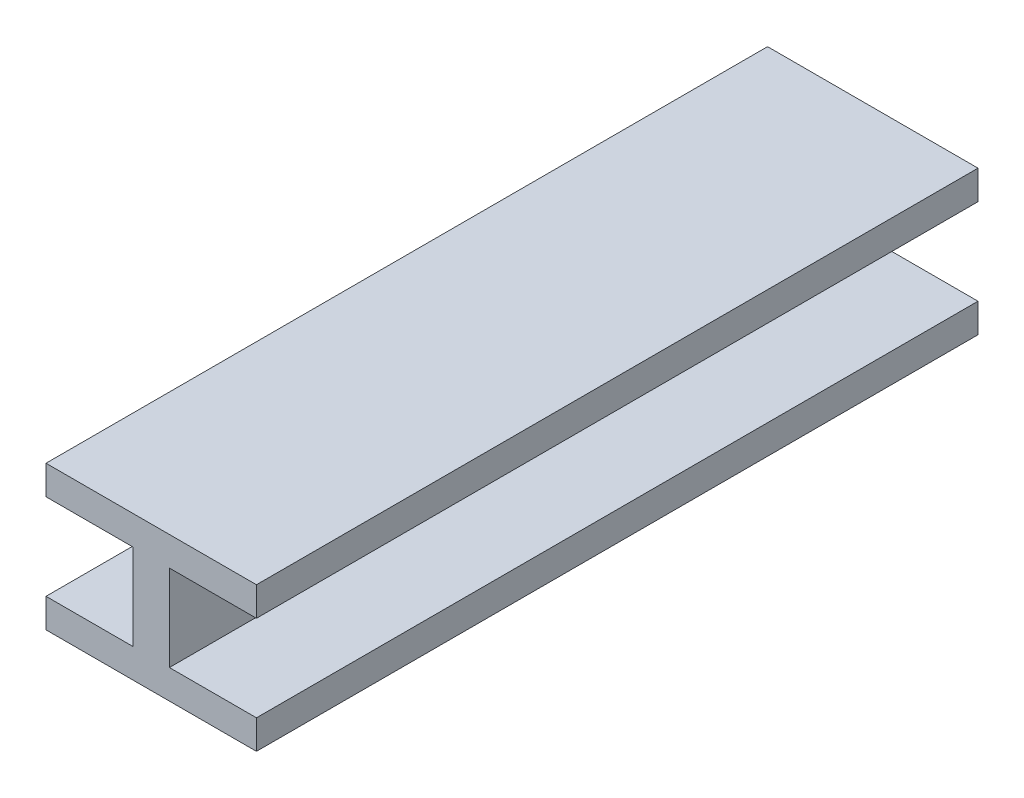
ISO-10303-21;
HEADER;
FILE_DESCRIPTION(('STEP AP214'),'2;1');
FILE_NAME('part.step','',(''),(''),'','','');
FILE_SCHEMA(('AUTOMOTIVE_DESIGN { 1 0 10303 214 1 1 1 1 }'));
ENDSEC;
DATA;
#1=APPLICATION_CONTEXT('core data for automotive mechanical design processes');
#2=APPLICATION_PROTOCOL_DEFINITION('international standard','automotive_design',2000,#1);
#3=PRODUCT_CONTEXT('',#1,'mechanical');
#4=PRODUCT('Part','Part','',(#3));
#5=PRODUCT_RELATED_PRODUCT_CATEGORY('part','',(#4));
#6=PRODUCT_DEFINITION_FORMATION('','',#4);
#7=PRODUCT_DEFINITION_CONTEXT('part definition',#1,'design');
#8=PRODUCT_DEFINITION('design','',#6,#7);
#9=PRODUCT_DEFINITION_SHAPE('','',#8);
#10=(LENGTH_UNIT() NAMED_UNIT(*) SI_UNIT(.MILLI.,.METRE.));
#11=(NAMED_UNIT(*) PLANE_ANGLE_UNIT() SI_UNIT($,.RADIAN.));
#12=(NAMED_UNIT(*) SI_UNIT($,.STERADIAN.) SOLID_ANGLE_UNIT());
#13=UNCERTAINTY_MEASURE_WITH_UNIT(LENGTH_MEASURE(1.E-05),#10,'distance_accuracy_value','');
#14=(GEOMETRIC_REPRESENTATION_CONTEXT(3) GLOBAL_UNCERTAINTY_ASSIGNED_CONTEXT((#13)) GLOBAL_UNIT_ASSIGNED_CONTEXT((#10,
#11,#12)) REPRESENTATION_CONTEXT('',''));
#15=CARTESIAN_POINT('',(0.,0.,0.));
#16=DIRECTION('',(0.,0.,1.));
#17=DIRECTION('',(1.,0.,0.));
#18=AXIS2_PLACEMENT_3D('',#15,#16,#17);
#19=CARTESIAN_POINT('',(-3.83718593749999,9.1005025,76.2));
#20=DIRECTION('',(0.,1.,0.));
#21=DIRECTION('',(-1.,0.,0.));
#22=AXIS2_PLACEMENT_3D('',#19,#20,#21);
#23=PLANE('',#22);
#24=DIRECTION('',(1.,0.,0.));
#25=VECTOR('',#24,1.);
#26=CARTESIAN_POINT('',(-3.83718593749999,9.1005025,-76.2));
#27=LINE('',#26,#25);
#28=CARTESIAN_POINT('',(-22.225,9.10050249999999,-76.2));
#29=VERTEX_POINT('',#28);
#30=CARTESIAN_POINT('',(-3.83718593749999,9.1005025,-76.2));
#31=VERTEX_POINT('',#30);
#32=EDGE_CURVE('E156',#29,#31,#27,.T.);
#33=ORIENTED_EDGE('',*,*,#32,.T.);
#34=DIRECTION('',(0.,0.,-1.));
#35=VECTOR('',#34,1.);
#36=CARTESIAN_POINT('',(-3.83718593749999,9.1005025,76.2));
#37=LINE('',#36,#35);
#38=CARTESIAN_POINT('',(-3.83718593749999,9.1005025,76.2));
#39=VERTEX_POINT('',#38);
#40=EDGE_CURVE('E11',#39,#31,#37,.T.);
#41=ORIENTED_EDGE('',*,*,#40,.F.);
#42=DIRECTION('',(1.,0.,0.));
#43=VECTOR('',#42,1.);
#44=CARTESIAN_POINT('',(-3.83718593749999,9.1005025,76.2));
#45=LINE('',#44,#43);
#46=CARTESIAN_POINT('',(-22.225,9.10050249999999,76.2));
#47=VERTEX_POINT('',#46);
#48=EDGE_CURVE('E178',#47,#39,#45,.T.);
#49=ORIENTED_EDGE('',*,*,#48,.F.);
#50=DIRECTION('',(0.,0.,-1.));
#51=VECTOR('',#50,1.);
#52=CARTESIAN_POINT('',(-22.225,9.10050249999999,76.2));
#53=LINE('',#52,#51);
#54=EDGE_CURVE('E152',#47,#29,#53,.T.);
#55=ORIENTED_EDGE('',*,*,#54,.T.);
#56=EDGE_LOOP('',(#33,#41,#49,#55));
#57=FACE_BOUND('',#56,.T.);
#58=ADVANCED_FACE('F36',(#57),#23,.F.);
#59=CARTESIAN_POINT('',(-3.83718593749999,9.1005025,76.2));
#60=DIRECTION('',(1.,0.,0.));
#61=DIRECTION('',(0.,0.,-1.));
#62=AXIS2_PLACEMENT_3D('',#59,#60,#61);
#63=PLANE('',#62);
#64=DIRECTION('',(0.,-1.,0.));
#65=VECTOR('',#64,1.);
#66=CARTESIAN_POINT('',(-3.83718593749999,9.1005025,-76.2));
#67=LINE('',#66,#65);
#68=CARTESIAN_POINT('',(-3.83718593749999,-9.1005025,-76.2));
#69=VERTEX_POINT('',#68);
#70=EDGE_CURVE('E159',#31,#69,#67,.T.);
#71=ORIENTED_EDGE('',*,*,#70,.T.);
#72=DIRECTION('',(0.,0.,-1.));
#73=VECTOR('',#72,1.);
#74=CARTESIAN_POINT('',(-3.83718593749999,-9.1005025,76.2));
#75=LINE('',#74,#73);
#76=CARTESIAN_POINT('',(-3.83718593749999,-9.1005025,76.2));
#77=VERTEX_POINT('',#76);
#78=EDGE_CURVE('E44',#77,#69,#75,.T.);
#79=ORIENTED_EDGE('',*,*,#78,.F.);
#80=DIRECTION('',(0.,-1.,0.));
#81=VECTOR('',#80,1.);
#82=CARTESIAN_POINT('',(-3.83718593749999,9.1005025,76.2));
#83=LINE('',#82,#81);
#84=EDGE_CURVE('E107',#39,#77,#83,.T.);
#85=ORIENTED_EDGE('',*,*,#84,.F.);
#86=ORIENTED_EDGE('',*,*,#40,.T.);
#87=EDGE_LOOP('',(#71,#79,#85,#86));
#88=FACE_BOUND('',#87,.T.);
#89=ADVANCED_FACE('F256',(#88),#63,.F.);
#90=CARTESIAN_POINT('',(-3.83718593749999,-9.1005025,76.2));
#91=DIRECTION('',(0.,-1.,0.));
#92=DIRECTION('',(1.,0.,0.));
#93=AXIS2_PLACEMENT_3D('',#90,#91,#92);
#94=PLANE('',#93);
#95=DIRECTION('',(-1.,0.,0.));
#96=VECTOR('',#95,1.);
#97=CARTESIAN_POINT('',(-3.83718593749999,-9.1005025,-76.2));
#98=LINE('',#97,#96);
#99=CARTESIAN_POINT('',(-22.225,-9.10050250000001,-76.2));
#100=VERTEX_POINT('',#99);
#101=EDGE_CURVE('E161',#69,#100,#98,.T.);
#102=ORIENTED_EDGE('',*,*,#101,.T.);
#103=DIRECTION('',(0.,0.,-1.));
#104=VECTOR('',#103,1.);
#105=CARTESIAN_POINT('',(-22.225,-9.10050250000001,76.2));
#106=LINE('',#105,#104);
#107=CARTESIAN_POINT('',(-22.225,-9.10050250000001,76.2));
#108=VERTEX_POINT('',#107);
#109=EDGE_CURVE('E197',#108,#100,#106,.T.);
#110=ORIENTED_EDGE('',*,*,#109,.F.);
#111=DIRECTION('',(-1.,0.,0.));
#112=VECTOR('',#111,1.);
#113=CARTESIAN_POINT('',(-3.83718593749999,-9.1005025,76.2));
#114=LINE('',#113,#112);
#115=EDGE_CURVE('E205',#77,#108,#114,.T.);
#116=ORIENTED_EDGE('',*,*,#115,.F.);
#117=ORIENTED_EDGE('',*,*,#78,.T.);
#118=EDGE_LOOP('',(#102,#110,#116,#117));
#119=FACE_BOUND('',#118,.T.);
#120=ADVANCED_FACE('F203',(#119),#94,.F.);
#121=CARTESIAN_POINT('',(-22.225,-9.10050250000001,76.2));
#122=DIRECTION('',(1.,0.,0.));
#123=DIRECTION('',(0.,1.,0.));
#124=AXIS2_PLACEMENT_3D('',#121,#122,#123);
#125=PLANE('',#124);
#126=DIRECTION('',(0.,-1.,0.));
#127=VECTOR('',#126,1.);
#128=CARTESIAN_POINT('',(-22.225,-9.10050250000001,-76.2));
#129=LINE('',#128,#127);
#130=CARTESIAN_POINT('',(-22.225,-15.24,-76.2));
#131=VERTEX_POINT('',#130);
#132=EDGE_CURVE('E163',#100,#131,#129,.T.);
#133=ORIENTED_EDGE('',*,*,#132,.T.);
#134=DIRECTION('',(0.,0.,-1.));
#135=VECTOR('',#134,1.);
#136=CARTESIAN_POINT('',(-22.225,-15.24,76.2));
#137=LINE('',#136,#135);
#138=CARTESIAN_POINT('',(-22.225,-15.24,76.2));
#139=VERTEX_POINT('',#138);
#140=EDGE_CURVE('E194',#139,#131,#137,.T.);
#141=ORIENTED_EDGE('',*,*,#140,.F.);
#142=DIRECTION('',(0.,-1.,0.));
#143=VECTOR('',#142,1.);
#144=CARTESIAN_POINT('',(-22.225,-9.10050250000001,76.2));
#145=LINE('',#144,#143);
#146=EDGE_CURVE('E223',#108,#139,#145,.T.);
#147=ORIENTED_EDGE('',*,*,#146,.F.);
#148=ORIENTED_EDGE('',*,*,#109,.T.);
#149=EDGE_LOOP('',(#133,#141,#147,#148));
#150=FACE_BOUND('',#149,.T.);
#151=ADVANCED_FACE('F214',(#150),#125,.F.);
#152=CARTESIAN_POINT('',(22.225,-15.24,76.2));
#153=DIRECTION('',(0.,1.,0.));
#154=DIRECTION('',(-1.,0.,0.));
#155=AXIS2_PLACEMENT_3D('',#152,#153,#154);
#156=PLANE('',#155);
#157=DIRECTION('',(1.,0.,0.));
#158=VECTOR('',#157,1.);
#159=CARTESIAN_POINT('',(22.225,-15.24,-76.2));
#160=LINE('',#159,#158);
#161=CARTESIAN_POINT('',(22.225,-15.24,-76.2));
#162=VERTEX_POINT('',#161);
#163=EDGE_CURVE('E165',#131,#162,#160,.T.);
#164=ORIENTED_EDGE('',*,*,#163,.T.);
#165=DIRECTION('',(0.,0.,-1.));
#166=VECTOR('',#165,1.);
#167=CARTESIAN_POINT('',(22.225,-15.24,76.2));
#168=LINE('',#167,#166);
#169=CARTESIAN_POINT('',(22.225,-15.24,76.2));
#170=VERTEX_POINT('',#169);
#171=EDGE_CURVE('E191',#170,#162,#168,.T.);
#172=ORIENTED_EDGE('',*,*,#171,.F.);
#173=DIRECTION('',(1.,0.,0.));
#174=VECTOR('',#173,1.);
#175=CARTESIAN_POINT('',(22.225,-15.24,76.2));
#176=LINE('',#175,#174);
#177=EDGE_CURVE('E220',#139,#170,#176,.T.);
#178=ORIENTED_EDGE('',*,*,#177,.F.);
#179=ORIENTED_EDGE('',*,*,#140,.T.);
#180=EDGE_LOOP('',(#164,#172,#178,#179));
#181=FACE_BOUND('',#180,.T.);
#182=ADVANCED_FACE('F218',(#181),#156,.F.);
#183=CARTESIAN_POINT('',(22.225,-9.1005025,76.2));
#184=DIRECTION('',(-1.,0.,0.));
#185=DIRECTION('',(0.,-1.,0.));
#186=AXIS2_PLACEMENT_3D('',#183,#184,#185);
#187=PLANE('',#186);
#188=DIRECTION('',(0.,1.,0.));
#189=VECTOR('',#188,1.);
#190=CARTESIAN_POINT('',(22.225,-9.1005025,-76.2));
#191=LINE('',#190,#189);
#192=CARTESIAN_POINT('',(22.225,-9.1005025,-76.2));
#193=VERTEX_POINT('',#192);
#194=EDGE_CURVE('E167',#162,#193,#191,.T.);
#195=ORIENTED_EDGE('',*,*,#194,.T.);
#196=DIRECTION('',(0.,0.,-1.));
#197=VECTOR('',#196,1.);
#198=CARTESIAN_POINT('',(22.225,-9.1005025,76.2));
#199=LINE('',#198,#197);
#200=CARTESIAN_POINT('',(22.225,-9.1005025,76.2));
#201=VERTEX_POINT('',#200);
#202=EDGE_CURVE('E188',#201,#193,#199,.T.);
#203=ORIENTED_EDGE('',*,*,#202,.F.);
#204=DIRECTION('',(0.,1.,0.));
#205=VECTOR('',#204,1.);
#206=CARTESIAN_POINT('',(22.225,-9.1005025,76.2));
#207=LINE('',#206,#205);
#208=EDGE_CURVE('E222',#170,#201,#207,.T.);
#209=ORIENTED_EDGE('',*,*,#208,.F.);
#210=ORIENTED_EDGE('',*,*,#171,.T.);
#211=EDGE_LOOP('',(#195,#203,#209,#210));
#212=FACE_BOUND('',#211,.T.);
#213=ADVANCED_FACE('F269',(#212),#187,.F.);
#214=CARTESIAN_POINT('',(3.83718593750001,-9.1005025,76.2));
#215=DIRECTION('',(0.,-1.,0.));
#216=DIRECTION('',(1.,0.,0.));
#217=AXIS2_PLACEMENT_3D('',#214,#215,#216);
#218=PLANE('',#217);
#219=DIRECTION('',(-1.,0.,0.));
#220=VECTOR('',#219,1.);
#221=CARTESIAN_POINT('',(3.83718593750001,-9.1005025,-76.2));
#222=LINE('',#221,#220);
#223=CARTESIAN_POINT('',(3.83718593750001,-9.1005025,-76.2));
#224=VERTEX_POINT('',#223);
#225=EDGE_CURVE('E169',#193,#224,#222,.T.);
#226=ORIENTED_EDGE('',*,*,#225,.T.);
#227=DIRECTION('',(0.,0.,-1.));
#228=VECTOR('',#227,1.);
#229=CARTESIAN_POINT('',(3.83718593750001,-9.1005025,76.2));
#230=LINE('',#229,#228);
#231=CARTESIAN_POINT('',(3.83718593750001,-9.1005025,76.2));
#232=VERTEX_POINT('',#231);
#233=EDGE_CURVE('E185',#232,#224,#230,.T.);
#234=ORIENTED_EDGE('',*,*,#233,.F.);
#235=DIRECTION('',(-1.,0.,0.));
#236=VECTOR('',#235,1.);
#237=CARTESIAN_POINT('',(3.83718593750001,-9.1005025,76.2));
#238=LINE('',#237,#236);
#239=EDGE_CURVE('E225',#201,#232,#238,.T.);
#240=ORIENTED_EDGE('',*,*,#239,.F.);
#241=ORIENTED_EDGE('',*,*,#202,.T.);
#242=EDGE_LOOP('',(#226,#234,#240,#241));
#243=FACE_BOUND('',#242,.T.);
#244=ADVANCED_FACE('F272',(#243),#218,.F.);
#245=CARTESIAN_POINT('',(3.8371859375,9.1005025,76.2));
#246=DIRECTION('',(-1.,0.,0.));
#247=DIRECTION('',(0.,-1.,0.));
#248=AXIS2_PLACEMENT_3D('',#245,#246,#247);
#249=PLANE('',#248);
#250=DIRECTION('',(0.,1.,0.));
#251=VECTOR('',#250,1.);
#252=CARTESIAN_POINT('',(3.8371859375,9.1005025,-76.2));
#253=LINE('',#252,#251);
#254=CARTESIAN_POINT('',(3.8371859375,9.1005025,-76.2));
#255=VERTEX_POINT('',#254);
#256=EDGE_CURVE('E171',#224,#255,#253,.T.);
#257=ORIENTED_EDGE('',*,*,#256,.T.);
#258=DIRECTION('',(0.,0.,-1.));
#259=VECTOR('',#258,1.);
#260=CARTESIAN_POINT('',(3.8371859375,9.1005025,76.2));
#261=LINE('',#260,#259);
#262=CARTESIAN_POINT('',(3.8371859375,9.1005025,76.2));
#263=VERTEX_POINT('',#262);
#264=EDGE_CURVE('E182',#263,#255,#261,.T.);
#265=ORIENTED_EDGE('',*,*,#264,.F.);
#266=DIRECTION('',(0.,1.,0.));
#267=VECTOR('',#266,1.);
#268=CARTESIAN_POINT('',(3.8371859375,9.1005025,76.2));
#269=LINE('',#268,#267);
#270=EDGE_CURVE('E231',#232,#263,#269,.T.);
#271=ORIENTED_EDGE('',*,*,#270,.F.);
#272=ORIENTED_EDGE('',*,*,#233,.T.);
#273=EDGE_LOOP('',(#257,#265,#271,#272));
#274=FACE_BOUND('',#273,.T.);
#275=ADVANCED_FACE('F237',(#274),#249,.F.);
#276=CARTESIAN_POINT('',(3.8371859375,9.1005025,76.2));
#277=DIRECTION('',(0.,1.,0.));
#278=DIRECTION('',(-1.,0.,0.));
#279=AXIS2_PLACEMENT_3D('',#276,#277,#278);
#280=PLANE('',#279);
#281=DIRECTION('',(1.,0.,0.));
#282=VECTOR('',#281,1.);
#283=CARTESIAN_POINT('',(3.8371859375,9.1005025,-76.2));
#284=LINE('',#283,#282);
#285=CARTESIAN_POINT('',(22.225,9.1005025,-76.2));
#286=VERTEX_POINT('',#285);
#287=EDGE_CURVE('E173',#255,#286,#284,.T.);
#288=ORIENTED_EDGE('',*,*,#287,.T.);
#289=DIRECTION('',(0.,0.,-1.));
#290=VECTOR('',#289,1.);
#291=CARTESIAN_POINT('',(22.225,9.1005025,76.2));
#292=LINE('',#291,#290);
#293=CARTESIAN_POINT('',(22.225,9.1005025,76.2));
#294=VERTEX_POINT('',#293);
#295=EDGE_CURVE('E147',#294,#286,#292,.T.);
#296=ORIENTED_EDGE('',*,*,#295,.F.);
#297=DIRECTION('',(1.,0.,0.));
#298=VECTOR('',#297,1.);
#299=CARTESIAN_POINT('',(3.8371859375,9.1005025,76.2));
#300=LINE('',#299,#298);
#301=EDGE_CURVE('E138',#263,#294,#300,.T.);
#302=ORIENTED_EDGE('',*,*,#301,.F.);
#303=ORIENTED_EDGE('',*,*,#264,.T.);
#304=EDGE_LOOP('',(#288,#296,#302,#303));
#305=FACE_BOUND('',#304,.T.);
#306=ADVANCED_FACE('F241',(#305),#280,.F.);
#307=CARTESIAN_POINT('',(22.225,9.1005025,76.2));
#308=DIRECTION('',(-1.,0.,0.));
#309=DIRECTION('',(0.,-1.,0.));
#310=AXIS2_PLACEMENT_3D('',#307,#308,#309);
#311=PLANE('',#310);
#312=DIRECTION('',(0.,1.,0.));
#313=VECTOR('',#312,1.);
#314=CARTESIAN_POINT('',(22.225,9.1005025,-76.2));
#315=LINE('',#314,#313);
#316=CARTESIAN_POINT('',(22.225,15.24,-76.2));
#317=VERTEX_POINT('',#316);
#318=EDGE_CURVE('E146',#286,#317,#315,.T.);
#319=ORIENTED_EDGE('',*,*,#318,.T.);
#320=DIRECTION('',(0.,0.,-1.));
#321=VECTOR('',#320,1.);
#322=CARTESIAN_POINT('',(22.225,15.24,76.2));
#323=LINE('',#322,#321);
#324=CARTESIAN_POINT('',(22.225,15.24,76.2));
#325=VERTEX_POINT('',#324);
#326=EDGE_CURVE('E143',#325,#317,#323,.T.);
#327=ORIENTED_EDGE('',*,*,#326,.F.);
#328=DIRECTION('',(0.,1.,0.));
#329=VECTOR('',#328,1.);
#330=CARTESIAN_POINT('',(22.225,9.1005025,76.2));
#331=LINE('',#330,#329);
#332=EDGE_CURVE('E132',#294,#325,#331,.T.);
#333=ORIENTED_EDGE('',*,*,#332,.F.);
#334=ORIENTED_EDGE('',*,*,#295,.T.);
#335=EDGE_LOOP('',(#319,#327,#333,#334));
#336=FACE_BOUND('',#335,.T.);
#337=ADVANCED_FACE('F144',(#336),#311,.F.);
#338=CARTESIAN_POINT('',(22.225,15.24,76.2));
#339=DIRECTION('',(0.,-1.,0.));
#340=DIRECTION('',(1.,0.,0.));
#341=AXIS2_PLACEMENT_3D('',#338,#339,#340);
#342=PLANE('',#341);
#343=DIRECTION('',(-1.,0.,0.));
#344=VECTOR('',#343,1.);
#345=CARTESIAN_POINT('',(22.225,15.24,-76.2));
#346=LINE('',#345,#344);
#347=CARTESIAN_POINT('',(-22.225,15.24,-76.2));
#348=VERTEX_POINT('',#347);
#349=EDGE_CURVE('E93',#317,#348,#346,.T.);
#350=ORIENTED_EDGE('',*,*,#349,.T.);
#351=DIRECTION('',(0.,0.,-1.));
#352=VECTOR('',#351,1.);
#353=CARTESIAN_POINT('',(-22.225,15.24,76.2));
#354=LINE('',#353,#352);
#355=CARTESIAN_POINT('',(-22.225,15.24,76.2));
#356=VERTEX_POINT('',#355);
#357=EDGE_CURVE('E148',#356,#348,#354,.T.);
#358=ORIENTED_EDGE('',*,*,#357,.F.);
#359=DIRECTION('',(-1.,0.,0.));
#360=VECTOR('',#359,1.);
#361=CARTESIAN_POINT('',(22.225,15.24,76.2));
#362=LINE('',#361,#360);
#363=EDGE_CURVE('E136',#325,#356,#362,.T.);
#364=ORIENTED_EDGE('',*,*,#363,.F.);
#365=ORIENTED_EDGE('',*,*,#326,.T.);
#366=EDGE_LOOP('',(#350,#358,#364,#365));
#367=FACE_BOUND('',#366,.T.);
#368=ADVANCED_FACE('F150',(#367),#342,.F.);
#369=CARTESIAN_POINT('',(-22.225,9.10050249999999,76.2));
#370=DIRECTION('',(1.,0.,0.));
#371=DIRECTION('',(0.,1.,0.));
#372=AXIS2_PLACEMENT_3D('',#369,#370,#371);
#373=PLANE('',#372);
#374=DIRECTION('',(0.,-1.,0.));
#375=VECTOR('',#374,1.);
#376=CARTESIAN_POINT('',(-22.225,9.10050249999999,-76.2));
#377=LINE('',#376,#375);
#378=EDGE_CURVE('E99',#348,#29,#377,.T.);
#379=ORIENTED_EDGE('',*,*,#378,.T.);
#380=ORIENTED_EDGE('',*,*,#54,.F.);
#381=DIRECTION('',(0.,-1.,0.));
#382=VECTOR('',#381,1.);
#383=CARTESIAN_POINT('',(-22.225,9.10050249999999,76.2));
#384=LINE('',#383,#382);
#385=EDGE_CURVE('E52',#356,#47,#384,.T.);
#386=ORIENTED_EDGE('',*,*,#385,.F.);
#387=ORIENTED_EDGE('',*,*,#357,.T.);
#388=EDGE_LOOP('',(#379,#380,#386,#387));
#389=FACE_BOUND('',#388,.T.);
#390=ADVANCED_FACE('F245',(#389),#373,.F.);
#391=CARTESIAN_POINT('',(0.,0.,76.2));
#392=DIRECTION('',(0.,0.,-1.));
#393=DIRECTION('',(-1.,0.,0.));
#394=AXIS2_PLACEMENT_3D('',#391,#392,#393);
#395=PLANE('',#394);
#396=ORIENTED_EDGE('',*,*,#48,.T.);
#397=ORIENTED_EDGE('',*,*,#84,.T.);
#398=ORIENTED_EDGE('',*,*,#115,.T.);
#399=ORIENTED_EDGE('',*,*,#146,.T.);
#400=ORIENTED_EDGE('',*,*,#177,.T.);
#401=ORIENTED_EDGE('',*,*,#208,.T.);
#402=ORIENTED_EDGE('',*,*,#239,.T.);
#403=ORIENTED_EDGE('',*,*,#270,.T.);
#404=ORIENTED_EDGE('',*,*,#301,.T.);
#405=ORIENTED_EDGE('',*,*,#332,.T.);
#406=ORIENTED_EDGE('',*,*,#363,.T.);
#407=ORIENTED_EDGE('',*,*,#385,.T.);
#408=EDGE_LOOP('',(#396,#397,#398,#399,#400,#401,#402,#403,#404,#405,#406,#407));
#409=FACE_BOUND('',#408,.T.);
#410=ADVANCED_FACE('F134',(#409),#395,.F.);
#411=CARTESIAN_POINT('',(0.,0.,-76.2));
#412=DIRECTION('',(0.,0.,-1.));
#413=DIRECTION('',(-1.,0.,0.));
#414=AXIS2_PLACEMENT_3D('',#411,#412,#413);
#415=PLANE('',#414);
#416=ORIENTED_EDGE('',*,*,#32,.F.);
#417=ORIENTED_EDGE('',*,*,#378,.F.);
#418=ORIENTED_EDGE('',*,*,#349,.F.);
#419=ORIENTED_EDGE('',*,*,#318,.F.);
#420=ORIENTED_EDGE('',*,*,#287,.F.);
#421=ORIENTED_EDGE('',*,*,#256,.F.);
#422=ORIENTED_EDGE('',*,*,#225,.F.);
#423=ORIENTED_EDGE('',*,*,#194,.F.);
#424=ORIENTED_EDGE('',*,*,#163,.F.);
#425=ORIENTED_EDGE('',*,*,#132,.F.);
#426=ORIENTED_EDGE('',*,*,#101,.F.);
#427=ORIENTED_EDGE('',*,*,#70,.F.);
#428=EDGE_LOOP('',(#416,#417,#418,#419,#420,#421,#422,#423,#424,#425,#426,#427));
#429=FACE_BOUND('',#428,.T.);
#430=ADVANCED_FACE('F209',(#429),#415,.T.);
#431=CLOSED_SHELL('',(#58,#89,#120,#151,#182,#213,#244,#275,#306,#337,#368,#390,#410,#430));
#432=MANIFOLD_SOLID_BREP('B2',#431);
#433=ADVANCED_BREP_SHAPE_REPRESENTATION('',(#18,#432),#14);
#434=SHAPE_DEFINITION_REPRESENTATION(#9,#433);
ENDSEC;
END-ISO-10303-21;
